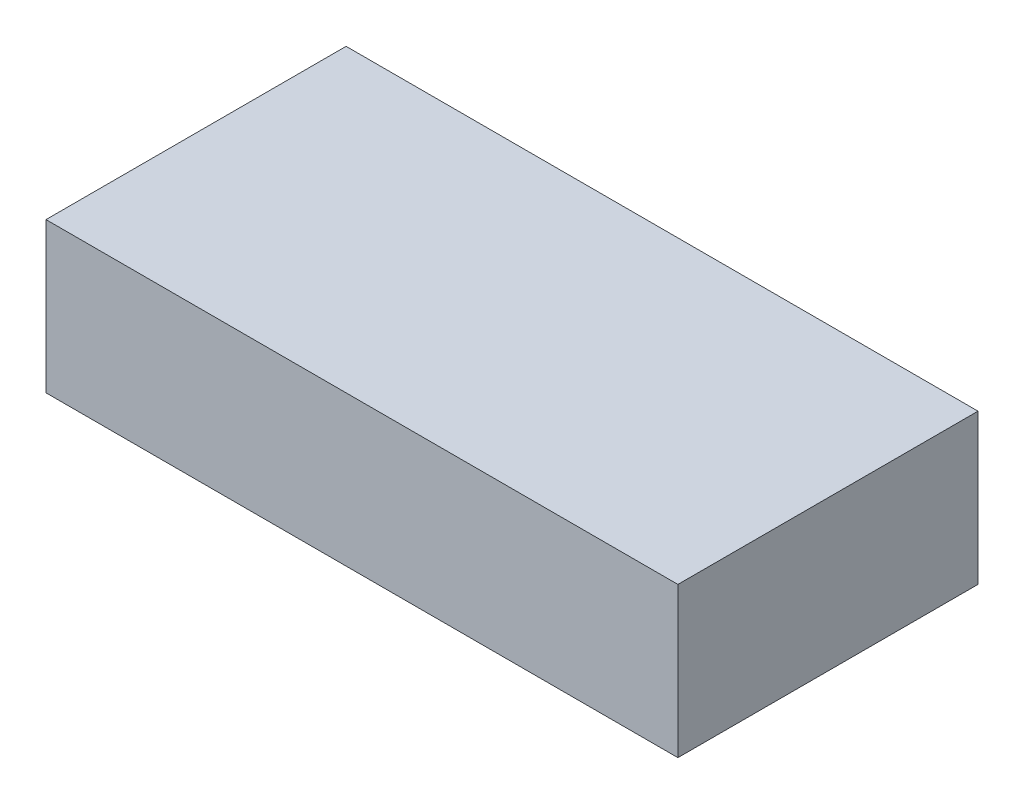
ISO-10303-21;
HEADER;
FILE_DESCRIPTION(('STEP AP214'),'2;1');
FILE_NAME('part.step','',(''),(''),'','','');
FILE_SCHEMA(('AUTOMOTIVE_DESIGN { 1 0 10303 214 1 1 1 1 }'));
ENDSEC;
DATA;
#1=APPLICATION_CONTEXT('core data for automotive mechanical design processes');
#2=APPLICATION_PROTOCOL_DEFINITION('international standard','automotive_design',2000,#1);
#3=PRODUCT_CONTEXT('',#1,'mechanical');
#4=PRODUCT('Part','Part','',(#3));
#5=PRODUCT_RELATED_PRODUCT_CATEGORY('part','',(#4));
#6=PRODUCT_DEFINITION_FORMATION('','',#4);
#7=PRODUCT_DEFINITION_CONTEXT('part definition',#1,'design');
#8=PRODUCT_DEFINITION('design','',#6,#7);
#9=PRODUCT_DEFINITION_SHAPE('','',#8);
#10=(LENGTH_UNIT() NAMED_UNIT(*) SI_UNIT(.MILLI.,.METRE.));
#11=(NAMED_UNIT(*) PLANE_ANGLE_UNIT() SI_UNIT($,.RADIAN.));
#12=(NAMED_UNIT(*) SI_UNIT($,.STERADIAN.) SOLID_ANGLE_UNIT());
#13=UNCERTAINTY_MEASURE_WITH_UNIT(LENGTH_MEASURE(1.E-05),#10,'distance_accuracy_value','');
#14=(GEOMETRIC_REPRESENTATION_CONTEXT(3) GLOBAL_UNCERTAINTY_ASSIGNED_CONTEXT((#13)) GLOBAL_UNIT_ASSIGNED_CONTEXT((#10,
#11,#12)) REPRESENTATION_CONTEXT('',''));
#15=CARTESIAN_POINT('',(0.,0.,0.));
#16=DIRECTION('',(0.,0.,1.));
#17=DIRECTION('',(1.,0.,0.));
#18=AXIS2_PLACEMENT_3D('',#15,#16,#17);
#19=CARTESIAN_POINT('',(37.973,18.034,18.034));
#20=DIRECTION('',(-1.,0.,0.));
#21=DIRECTION('',(0.,0.,1.));
#22=AXIS2_PLACEMENT_3D('',#19,#20,#21);
#23=PLANE('',#22);
#24=DIRECTION('',(0.,0.,-1.));
#25=VECTOR('',#24,1.);
#26=CARTESIAN_POINT('',(37.973,0.,18.034));
#27=LINE('',#26,#25);
#28=CARTESIAN_POINT('',(37.973,0.,18.034));
#29=VERTEX_POINT('',#28);
#30=CARTESIAN_POINT('',(37.973,0.,-18.034));
#31=VERTEX_POINT('',#30);
#32=EDGE_CURVE('E107',#29,#31,#27,.T.);
#33=ORIENTED_EDGE('',*,*,#32,.T.);
#34=DIRECTION('',(0.,-1.,0.));
#35=VECTOR('',#34,1.);
#36=CARTESIAN_POINT('',(37.973,18.034,-18.034));
#37=LINE('',#36,#35);
#38=CARTESIAN_POINT('',(37.973,18.034,-18.034));
#39=VERTEX_POINT('',#38);
#40=EDGE_CURVE('E98',#39,#31,#37,.T.);
#41=ORIENTED_EDGE('',*,*,#40,.F.);
#42=DIRECTION('',(0.,0.,-1.));
#43=VECTOR('',#42,1.);
#44=CARTESIAN_POINT('',(37.973,18.034,18.034));
#45=LINE('',#44,#43);
#46=CARTESIAN_POINT('',(37.973,18.034,18.034));
#47=VERTEX_POINT('',#46);
#48=EDGE_CURVE('E92',#47,#39,#45,.T.);
#49=ORIENTED_EDGE('',*,*,#48,.F.);
#50=DIRECTION('',(0.,-1.,0.));
#51=VECTOR('',#50,1.);
#52=CARTESIAN_POINT('',(37.973,18.034,18.034));
#53=LINE('',#52,#51);
#54=EDGE_CURVE('E103',#47,#29,#53,.T.);
#55=ORIENTED_EDGE('',*,*,#54,.T.);
#56=EDGE_LOOP('',(#33,#41,#49,#55));
#57=FACE_BOUND('',#56,.T.);
#58=ADVANCED_FACE('F40',(#57),#23,.F.);
#59=CARTESIAN_POINT('',(-37.973,18.034,-18.034));
#60=DIRECTION('',(0.,0.,1.));
#61=DIRECTION('',(1.,0.,0.));
#62=AXIS2_PLACEMENT_3D('',#59,#60,#61);
#63=PLANE('',#62);
#64=DIRECTION('',(-1.,0.,0.));
#65=VECTOR('',#64,1.);
#66=CARTESIAN_POINT('',(-37.973,0.,-18.034));
#67=LINE('',#66,#65);
#68=CARTESIAN_POINT('',(-37.973,0.,-18.034));
#69=VERTEX_POINT('',#68);
#70=EDGE_CURVE('E97',#31,#69,#67,.T.);
#71=ORIENTED_EDGE('',*,*,#70,.T.);
#72=DIRECTION('',(0.,-1.,0.));
#73=VECTOR('',#72,1.);
#74=CARTESIAN_POINT('',(-37.973,18.034,-18.034));
#75=LINE('',#74,#73);
#76=CARTESIAN_POINT('',(-37.973,18.034,-18.034));
#77=VERTEX_POINT('',#76);
#78=EDGE_CURVE('E95',#77,#69,#75,.T.);
#79=ORIENTED_EDGE('',*,*,#78,.F.);
#80=DIRECTION('',(-1.,0.,0.));
#81=VECTOR('',#80,1.);
#82=CARTESIAN_POINT('',(-37.973,18.034,-18.034));
#83=LINE('',#82,#81);
#84=EDGE_CURVE('E87',#39,#77,#83,.T.);
#85=ORIENTED_EDGE('',*,*,#84,.F.);
#86=ORIENTED_EDGE('',*,*,#40,.T.);
#87=EDGE_LOOP('',(#71,#79,#85,#86));
#88=FACE_BOUND('',#87,.T.);
#89=ADVANCED_FACE('F96',(#88),#63,.F.);
#90=CARTESIAN_POINT('',(-37.973,18.034,18.034));
#91=DIRECTION('',(1.,0.,0.));
#92=DIRECTION('',(0.,0.,-1.));
#93=AXIS2_PLACEMENT_3D('',#90,#91,#92);
#94=PLANE('',#93);
#95=CARTESIAN_POINT('',(-37.973,8.509,3.556));
#96=DIRECTION('',(1.,0.,0.));
#97=DIRECTION('',(0.,0.,-1.));
#98=AXIS2_PLACEMENT_3D('',#95,#96,#97);
#99=CIRCLE('',#98,2.54);
#100=CARTESIAN_POINT('',(-37.973,8.509,1.016));
#101=VERTEX_POINT('',#100);
#102=EDGE_CURVE('E11',#101,#101,#99,.F.);
#103=ORIENTED_EDGE('',*,*,#102,.F.);
#104=EDGE_LOOP('',(#103));
#105=FACE_BOUND('',#104,.T.);
#106=CARTESIAN_POINT('',(-37.973,8.509,-3.556));
#107=DIRECTION('',(-1.,0.,0.));
#108=DIRECTION('',(0.,0.,1.));
#109=AXIS2_PLACEMENT_3D('',#106,#107,#108);
#110=CIRCLE('',#109,2.54);
#111=CARTESIAN_POINT('',(-37.973,8.509,-1.016));
#112=VERTEX_POINT('',#111);
#113=EDGE_CURVE('E48',#112,#112,#110,.T.);
#114=ORIENTED_EDGE('',*,*,#113,.F.);
#115=EDGE_LOOP('',(#114));
#116=FACE_BOUND('',#115,.T.);
#117=DIRECTION('',(0.,0.,1.));
#118=VECTOR('',#117,1.);
#119=CARTESIAN_POINT('',(-37.973,0.,18.034));
#120=LINE('',#119,#118);
#121=CARTESIAN_POINT('',(-37.973,0.,18.034));
#122=VERTEX_POINT('',#121);
#123=EDGE_CURVE('E73',#69,#122,#120,.T.);
#124=ORIENTED_EDGE('',*,*,#123,.T.);
#125=DIRECTION('',(0.,-1.,0.));
#126=VECTOR('',#125,1.);
#127=CARTESIAN_POINT('',(-37.973,18.034,18.034));
#128=LINE('',#127,#126);
#129=CARTESIAN_POINT('',(-37.973,18.034,18.034));
#130=VERTEX_POINT('',#129);
#131=EDGE_CURVE('E99',#130,#122,#128,.T.);
#132=ORIENTED_EDGE('',*,*,#131,.F.);
#133=DIRECTION('',(0.,0.,1.));
#134=VECTOR('',#133,1.);
#135=CARTESIAN_POINT('',(-37.973,18.034,18.034));
#136=LINE('',#135,#134);
#137=EDGE_CURVE('E90',#77,#130,#136,.T.);
#138=ORIENTED_EDGE('',*,*,#137,.F.);
#139=ORIENTED_EDGE('',*,*,#78,.T.);
#140=EDGE_LOOP('',(#124,#132,#138,#139));
#141=FACE_BOUND('',#140,.T.);
#142=ADVANCED_FACE('F101',(#105,#116,#141),#94,.F.);
#143=CARTESIAN_POINT('',(-37.973,18.034,18.034));
#144=DIRECTION('',(0.,0.,-1.));
#145=DIRECTION('',(-1.,0.,0.));
#146=AXIS2_PLACEMENT_3D('',#143,#144,#145);
#147=PLANE('',#146);
#148=DIRECTION('',(1.,0.,0.));
#149=VECTOR('',#148,1.);
#150=CARTESIAN_POINT('',(-37.973,0.,18.034));
#151=LINE('',#150,#149);
#152=EDGE_CURVE('E79',#122,#29,#151,.T.);
#153=ORIENTED_EDGE('',*,*,#152,.T.);
#154=ORIENTED_EDGE('',*,*,#54,.F.);
#155=DIRECTION('',(1.,0.,0.));
#156=VECTOR('',#155,1.);
#157=CARTESIAN_POINT('',(-37.973,18.034,18.034));
#158=LINE('',#157,#156);
#159=EDGE_CURVE('E56',#130,#47,#158,.T.);
#160=ORIENTED_EDGE('',*,*,#159,.F.);
#161=ORIENTED_EDGE('',*,*,#131,.T.);
#162=EDGE_LOOP('',(#153,#154,#160,#161));
#163=FACE_BOUND('',#162,.T.);
#164=ADVANCED_FACE('F137',(#163),#147,.F.);
#165=CARTESIAN_POINT('',(0.,18.034,0.));
#166=DIRECTION('',(0.,-1.,0.));
#167=DIRECTION('',(0.,0.,-1.));
#168=AXIS2_PLACEMENT_3D('',#165,#166,#167);
#169=PLANE('',#168);
#170=ORIENTED_EDGE('',*,*,#48,.T.);
#171=ORIENTED_EDGE('',*,*,#84,.T.);
#172=ORIENTED_EDGE('',*,*,#137,.T.);
#173=ORIENTED_EDGE('',*,*,#159,.T.);
#174=EDGE_LOOP('',(#170,#171,#172,#173));
#175=FACE_BOUND('',#174,.T.);
#176=ADVANCED_FACE('F88',(#175),#169,.F.);
#177=CARTESIAN_POINT('',(0.,0.,0.));
#178=DIRECTION('',(0.,-1.,0.));
#179=DIRECTION('',(0.,0.,-1.));
#180=AXIS2_PLACEMENT_3D('',#177,#178,#179);
#181=PLANE('',#180);
#182=ORIENTED_EDGE('',*,*,#32,.F.);
#183=ORIENTED_EDGE('',*,*,#152,.F.);
#184=ORIENTED_EDGE('',*,*,#123,.F.);
#185=ORIENTED_EDGE('',*,*,#70,.F.);
#186=EDGE_LOOP('',(#182,#183,#184,#185));
#187=FACE_BOUND('',#186,.T.);
#188=ADVANCED_FACE('F152',(#187),#181,.T.);
#189=CARTESIAN_POINT('',(-40.513,8.509,-3.556));
#190=DIRECTION('',(1.,0.,0.));
#191=DIRECTION('',(0.,0.,-1.));
#192=AXIS2_PLACEMENT_3D('',#189,#190,#191);
#193=CYLINDRICAL_SURFACE('',#192,2.54);
#194=CARTESIAN_POINT('',(-40.513,8.509,-3.556));
#195=DIRECTION('',(-1.,0.,0.));
#196=DIRECTION('',(0.,0.,1.));
#197=AXIS2_PLACEMENT_3D('',#194,#195,#196);
#198=CIRCLE('',#197,2.54);
#199=CARTESIAN_POINT('',(-40.513,8.509,-1.016));
#200=VERTEX_POINT('',#199);
#201=EDGE_CURVE('E110',#200,#200,#198,.T.);
#202=ORIENTED_EDGE('',*,*,#201,.F.);
#203=EDGE_LOOP('',(#202));
#204=FACE_BOUND('',#203,.T.);
#205=ORIENTED_EDGE('',*,*,#113,.T.);
#206=EDGE_LOOP('',(#205));
#207=FACE_BOUND('',#206,.T.);
#208=ADVANCED_FACE('F154',(#204,#207),#193,.T.);
#209=CARTESIAN_POINT('',(-40.513,8.509,-3.556));
#210=DIRECTION('',(-1.,0.,0.));
#211=DIRECTION('',(0.,0.,1.));
#212=AXIS2_PLACEMENT_3D('',#209,#210,#211);
#213=PLANE('',#212);
#214=ORIENTED_EDGE('',*,*,#201,.T.);
#215=EDGE_LOOP('',(#214));
#216=FACE_BOUND('',#215,.T.);
#217=ADVANCED_FACE('F131',(#216),#213,.T.);
#218=CARTESIAN_POINT('',(-40.513,8.509,3.556));
#219=DIRECTION('',(1.,0.,0.));
#220=DIRECTION('',(0.,0.,-1.));
#221=AXIS2_PLACEMENT_3D('',#218,#219,#220);
#222=CYLINDRICAL_SURFACE('',#221,2.54);
#223=CARTESIAN_POINT('',(-40.513,8.509,3.556));
#224=DIRECTION('',(-1.,0.,0.));
#225=DIRECTION('',(0.,0.,-1.));
#226=AXIS2_PLACEMENT_3D('',#223,#224,#225);
#227=CIRCLE('',#226,2.54);
#228=CARTESIAN_POINT('',(-40.513,8.509,1.016));
#229=VERTEX_POINT('',#228);
#230=EDGE_CURVE('E122',#229,#229,#227,.T.);
#231=ORIENTED_EDGE('',*,*,#230,.F.);
#232=EDGE_LOOP('',(#231));
#233=FACE_BOUND('',#232,.T.);
#234=ORIENTED_EDGE('',*,*,#102,.T.);
#235=EDGE_LOOP('',(#234));
#236=FACE_BOUND('',#235,.T.);
#237=ADVANCED_FACE('F128',(#233,#236),#222,.T.);
#238=CARTESIAN_POINT('',(-40.513,8.509,3.556));
#239=DIRECTION('',(1.,0.,0.));
#240=DIRECTION('',(0.,0.,-1.));
#241=AXIS2_PLACEMENT_3D('',#238,#239,#240);
#242=PLANE('',#241);
#243=ORIENTED_EDGE('',*,*,#230,.T.);
#244=EDGE_LOOP('',(#243));
#245=FACE_BOUND('',#244,.T.);
#246=ADVANCED_FACE('F126',(#245),#242,.F.);
#247=CLOSED_SHELL('',(#58,#89,#142,#164,#176,#188,#208,#217,#237,#246));
#248=MANIFOLD_SOLID_BREP('B2',#247);
#249=ADVANCED_BREP_SHAPE_REPRESENTATION('',(#18,#248),#14);
#250=SHAPE_DEFINITION_REPRESENTATION(#9,#249);
ENDSEC;
END-ISO-10303-21;
